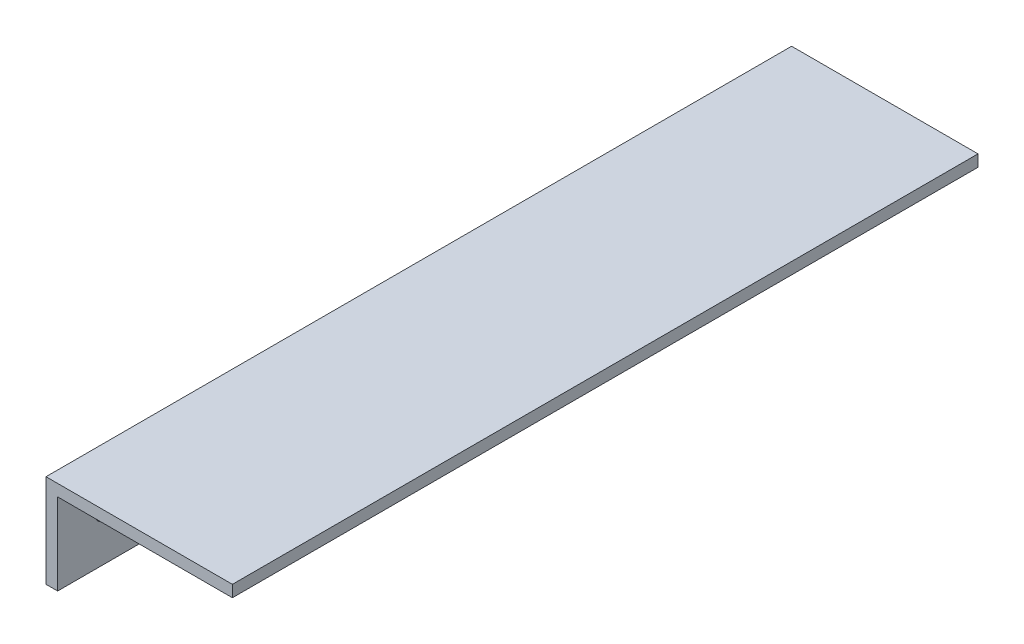
ISO-10303-21;
HEADER;
FILE_DESCRIPTION(('STEP AP214'),'2;1');
FILE_NAME('part.step','',(''),(''),'','','');
FILE_SCHEMA(('AUTOMOTIVE_DESIGN { 1 0 10303 214 1 1 1 1 }'));
ENDSEC;
DATA;
#1=APPLICATION_CONTEXT('core data for automotive mechanical design processes');
#2=APPLICATION_PROTOCOL_DEFINITION('international standard','automotive_design',2000,#1);
#3=PRODUCT_CONTEXT('',#1,'mechanical');
#4=PRODUCT('Part','Part','',(#3));
#5=PRODUCT_RELATED_PRODUCT_CATEGORY('part','',(#4));
#6=PRODUCT_DEFINITION_FORMATION('','',#4);
#7=PRODUCT_DEFINITION_CONTEXT('part definition',#1,'design');
#8=PRODUCT_DEFINITION('design','',#6,#7);
#9=PRODUCT_DEFINITION_SHAPE('','',#8);
#10=(LENGTH_UNIT() NAMED_UNIT(*) SI_UNIT(.MILLI.,.METRE.));
#11=(NAMED_UNIT(*) PLANE_ANGLE_UNIT() SI_UNIT($,.RADIAN.));
#12=(NAMED_UNIT(*) SI_UNIT($,.STERADIAN.) SOLID_ANGLE_UNIT());
#13=UNCERTAINTY_MEASURE_WITH_UNIT(LENGTH_MEASURE(1.E-05),#10,'distance_accuracy_value','');
#14=(GEOMETRIC_REPRESENTATION_CONTEXT(3) GLOBAL_UNCERTAINTY_ASSIGNED_CONTEXT((#13)) GLOBAL_UNIT_ASSIGNED_CONTEXT((#10,
#11,#12)) REPRESENTATION_CONTEXT('',''));
#15=CARTESIAN_POINT('',(0.,0.,0.));
#16=DIRECTION('',(0.,0.,1.));
#17=DIRECTION('',(1.,0.,0.));
#18=AXIS2_PLACEMENT_3D('',#15,#16,#17);
#19=CARTESIAN_POINT('',(3.175,6.34999999999999,203.2));
#20=DIRECTION('',(1.,0.,0.));
#21=DIRECTION('',(0.,-1.,0.));
#22=AXIS2_PLACEMENT_3D('',#19,#20,#21);
#23=PLANE('',#22);
#24=CARTESIAN_POINT('',(3.17500000000001,-6.35000000000001,190.5));
#25=DIRECTION('',(-1.,0.,0.));
#26=DIRECTION('',(0.,-1.,0.));
#27=AXIS2_PLACEMENT_3D('',#24,#25,#26);
#28=CIRCLE('',#27,2.38125000000001);
#29=CARTESIAN_POINT('',(3.17500000000001,-8.73125000000001,190.5));
#30=VERTEX_POINT('',#29);
#31=EDGE_CURVE('E121',#30,#30,#28,.T.);
#32=ORIENTED_EDGE('',*,*,#31,.T.);
#33=EDGE_LOOP('',(#32));
#34=FACE_BOUND('',#33,.T.);
#35=CARTESIAN_POINT('',(3.17500000000001,-6.35000000000001,139.7));
#36=DIRECTION('',(-1.,0.,0.));
#37=DIRECTION('',(0.,-1.,0.));
#38=AXIS2_PLACEMENT_3D('',#35,#36,#37);
#39=CIRCLE('',#38,2.38125000000001);
#40=CARTESIAN_POINT('',(3.17500000000001,-8.73125000000001,139.7));
#41=VERTEX_POINT('',#40);
#42=EDGE_CURVE('E213',#41,#41,#39,.T.);
#43=ORIENTED_EDGE('',*,*,#42,.T.);
#44=EDGE_LOOP('',(#43));
#45=FACE_BOUND('',#44,.T.);
#46=CARTESIAN_POINT('',(3.17500000000001,-6.35000000000001,88.9000000000001));
#47=DIRECTION('',(-1.,0.,0.));
#48=DIRECTION('',(0.,-1.,0.));
#49=AXIS2_PLACEMENT_3D('',#46,#47,#48);
#50=CIRCLE('',#49,2.38125000000001);
#51=CARTESIAN_POINT('',(3.17500000000001,-8.73125000000001,88.9000000000001));
#52=VERTEX_POINT('',#51);
#53=EDGE_CURVE('E211',#52,#52,#50,.T.);
#54=ORIENTED_EDGE('',*,*,#53,.T.);
#55=EDGE_LOOP('',(#54));
#56=FACE_BOUND('',#55,.T.);
#57=CARTESIAN_POINT('',(3.17500000000001,-6.35000000000001,38.1000000000001));
#58=DIRECTION('',(-1.,0.,0.));
#59=DIRECTION('',(0.,-1.,0.));
#60=AXIS2_PLACEMENT_3D('',#57,#58,#59);
#61=CIRCLE('',#60,2.38125000000001);
#62=CARTESIAN_POINT('',(3.17500000000001,-8.73125000000001,38.1000000000001));
#63=VERTEX_POINT('',#62);
#64=EDGE_CURVE('E208',#63,#63,#61,.T.);
#65=ORIENTED_EDGE('',*,*,#64,.T.);
#66=EDGE_LOOP('',(#65));
#67=FACE_BOUND('',#66,.T.);
#68=DIRECTION('',(0.,0.,-1.));
#69=VECTOR('',#68,1.);
#70=CARTESIAN_POINT('',(3.175,3.175,203.2));
#71=LINE('',#70,#69);
#72=CARTESIAN_POINT('',(3.175,3.175,203.2));
#73=VERTEX_POINT('',#72);
#74=CARTESIAN_POINT('',(3.175,3.175,0.));
#75=VERTEX_POINT('',#74);
#76=EDGE_CURVE('E114',#73,#75,#71,.T.);
#77=ORIENTED_EDGE('',*,*,#76,.F.);
#78=DIRECTION('',(0.,1.,0.));
#79=VECTOR('',#78,1.);
#80=CARTESIAN_POINT('',(3.175,6.34999999999999,203.2));
#81=LINE('',#80,#79);
#82=CARTESIAN_POINT('',(3.17500000000001,-19.05,203.2));
#83=VERTEX_POINT('',#82);
#84=EDGE_CURVE('E100',#83,#73,#81,.T.);
#85=ORIENTED_EDGE('',*,*,#84,.F.);
#86=DIRECTION('',(0.,0.,-1.));
#87=VECTOR('',#86,1.);
#88=CARTESIAN_POINT('',(3.17500000000001,-19.05,203.2));
#89=LINE('',#88,#87);
#90=CARTESIAN_POINT('',(3.17500000000001,-19.05,14.9909517868229));
#91=VERTEX_POINT('',#90);
#92=EDGE_CURVE('E106',#83,#91,#89,.T.);
#93=ORIENTED_EDGE('',*,*,#92,.T.);
#94=DIRECTION('',(0.,-0.829037572555043,0.559192903470745));
#95=VECTOR('',#94,1.);
#96=CARTESIAN_POINT('',(3.17500000000002,-88.8446916569376,62.0680657398183));
#97=LINE('',#96,#95);
#98=EDGE_CURVE('E152',#75,#91,#97,.T.);
#99=ORIENTED_EDGE('',*,*,#98,.F.);
#100=EDGE_LOOP('',(#77,#85,#93,#99));
#101=FACE_BOUND('',#100,.T.);
#102=ADVANCED_FACE('F41',(#34,#45,#56,#67,#101),#23,.T.);
#103=CARTESIAN_POINT('',(0.,-19.05,203.2));
#104=DIRECTION('',(0.,-1.,0.));
#105=DIRECTION('',(-1.,0.,0.));
#106=AXIS2_PLACEMENT_3D('',#103,#104,#105);
#107=PLANE('',#106);
#108=ORIENTED_EDGE('',*,*,#92,.F.);
#109=DIRECTION('',(1.,0.,0.));
#110=VECTOR('',#109,1.);
#111=CARTESIAN_POINT('',(0.,-19.05,203.2));
#112=LINE('',#111,#110);
#113=CARTESIAN_POINT('',(0.,-19.05,203.2));
#114=VERTEX_POINT('',#113);
#115=EDGE_CURVE('E97',#114,#83,#112,.T.);
#116=ORIENTED_EDGE('',*,*,#115,.F.);
#117=DIRECTION('',(0.,0.,-1.));
#118=VECTOR('',#117,1.);
#119=CARTESIAN_POINT('',(0.,-19.05,203.2));
#120=LINE('',#119,#118);
#121=CARTESIAN_POINT('',(0.,-19.05,14.9909517868229));
#122=VERTEX_POINT('',#121);
#123=EDGE_CURVE('E111',#114,#122,#120,.T.);
#124=ORIENTED_EDGE('',*,*,#123,.T.);
#125=DIRECTION('',(-1.,0.,0.));
#126=VECTOR('',#125,1.);
#127=CARTESIAN_POINT('',(0.,-19.05,14.9909517868229));
#128=LINE('',#127,#126);
#129=EDGE_CURVE('E49',#91,#122,#128,.T.);
#130=ORIENTED_EDGE('',*,*,#129,.F.);
#131=EDGE_LOOP('',(#108,#116,#124,#130));
#132=FACE_BOUND('',#131,.T.);
#133=ADVANCED_FACE('F107',(#132),#107,.T.);
#134=CARTESIAN_POINT('',(0.,6.34999999999999,203.2));
#135=DIRECTION('',(-1.,0.,0.));
#136=DIRECTION('',(0.,0.,1.));
#137=AXIS2_PLACEMENT_3D('',#134,#135,#136);
#138=PLANE('',#137);
#139=CARTESIAN_POINT('',(0.,-6.35000000000001,190.5));
#140=DIRECTION('',(1.,0.,0.));
#141=DIRECTION('',(0.,0.,1.));
#142=AXIS2_PLACEMENT_3D('',#139,#140,#141);
#143=CIRCLE('',#142,2.38125000000001);
#144=CARTESIAN_POINT('',(0.,-6.35000000000001,192.88125));
#145=VERTEX_POINT('',#144);
#146=EDGE_CURVE('E191',#145,#145,#143,.T.);
#147=ORIENTED_EDGE('',*,*,#146,.T.);
#148=EDGE_LOOP('',(#147));
#149=FACE_BOUND('',#148,.T.);
#150=CARTESIAN_POINT('',(0.,-6.35000000000001,139.7));
#151=DIRECTION('',(1.,0.,0.));
#152=DIRECTION('',(0.,0.,1.));
#153=AXIS2_PLACEMENT_3D('',#150,#151,#152);
#154=CIRCLE('',#153,2.38125000000001);
#155=CARTESIAN_POINT('',(0.,-6.35000000000001,142.08125));
#156=VERTEX_POINT('',#155);
#157=EDGE_CURVE('E195',#156,#156,#154,.T.);
#158=ORIENTED_EDGE('',*,*,#157,.T.);
#159=EDGE_LOOP('',(#158));
#160=FACE_BOUND('',#159,.T.);
#161=CARTESIAN_POINT('',(0.,-6.35000000000001,88.9000000000001));
#162=DIRECTION('',(1.,0.,0.));
#163=DIRECTION('',(0.,0.,1.));
#164=AXIS2_PLACEMENT_3D('',#161,#162,#163);
#165=CIRCLE('',#164,2.38125000000001);
#166=CARTESIAN_POINT('',(0.,-6.35000000000001,91.2812500000001));
#167=VERTEX_POINT('',#166);
#168=EDGE_CURVE('E199',#167,#167,#165,.T.);
#169=ORIENTED_EDGE('',*,*,#168,.T.);
#170=EDGE_LOOP('',(#169));
#171=FACE_BOUND('',#170,.T.);
#172=CARTESIAN_POINT('',(0.,-6.35000000000001,38.1000000000001));
#173=DIRECTION('',(1.,0.,0.));
#174=DIRECTION('',(0.,0.,1.));
#175=AXIS2_PLACEMENT_3D('',#172,#173,#174);
#176=CIRCLE('',#175,2.38125000000001);
#177=CARTESIAN_POINT('',(0.,-6.35000000000001,40.4812500000001));
#178=VERTEX_POINT('',#177);
#179=EDGE_CURVE('E202',#178,#178,#176,.T.);
#180=ORIENTED_EDGE('',*,*,#179,.T.);
#181=EDGE_LOOP('',(#180));
#182=FACE_BOUND('',#181,.T.);
#183=ORIENTED_EDGE('',*,*,#123,.F.);
#184=DIRECTION('',(0.,-1.,0.));
#185=VECTOR('',#184,1.);
#186=CARTESIAN_POINT('',(0.,6.34999999999999,203.2));
#187=LINE('',#186,#185);
#188=CARTESIAN_POINT('',(0.,6.34999999999999,203.2));
#189=VERTEX_POINT('',#188);
#190=EDGE_CURVE('E103',#189,#114,#187,.T.);
#191=ORIENTED_EDGE('',*,*,#190,.F.);
#192=DIRECTION('',(0.,0.,-1.));
#193=VECTOR('',#192,1.);
#194=CARTESIAN_POINT('',(0.,6.34999999999999,203.2));
#195=LINE('',#194,#193);
#196=CARTESIAN_POINT('',(0.,6.34999999999999,0.));
#197=VERTEX_POINT('',#196);
#198=EDGE_CURVE('E147',#189,#197,#195,.T.);
#199=ORIENTED_EDGE('',*,*,#198,.T.);
#200=DIRECTION('',(0.,-1.,0.));
#201=VECTOR('',#200,1.);
#202=CARTESIAN_POINT('',(0.,6.34999999999999,0.));
#203=LINE('',#202,#201);
#204=CARTESIAN_POINT('',(0.,3.1750000000001,0.));
#205=VERTEX_POINT('',#204);
#206=EDGE_CURVE('E133',#197,#205,#203,.T.);
#207=ORIENTED_EDGE('',*,*,#206,.T.);
#208=DIRECTION('',(0.,0.829037572555043,-0.559192903470745));
#209=VECTOR('',#208,1.);
#210=CARTESIAN_POINT('',(0.,-88.8446916569376,62.0680657398183));
#211=LINE('',#210,#209);
#212=EDGE_CURVE('E11',#122,#205,#211,.T.);
#213=ORIENTED_EDGE('',*,*,#212,.F.);
#214=EDGE_LOOP('',(#183,#191,#199,#207,#213));
#215=FACE_BOUND('',#214,.T.);
#216=ADVANCED_FACE('F154',(#149,#160,#171,#182,#215),#138,.T.);
#217=CARTESIAN_POINT('',(0.,6.34999999999999,203.2));
#218=DIRECTION('',(0.,-1.,0.));
#219=DIRECTION('',(0.,0.,1.));
#220=AXIS2_PLACEMENT_3D('',#217,#218,#219);
#221=PLANE('',#220);
#222=DIRECTION('',(1.,0.,0.));
#223=VECTOR('',#222,1.);
#224=CARTESIAN_POINT('',(0.,6.34999999999999,0.));
#225=LINE('',#224,#223);
#226=CARTESIAN_POINT('',(50.8,6.35000000000001,0.));
#227=VERTEX_POINT('',#226);
#228=EDGE_CURVE('E135',#197,#227,#225,.T.);
#229=ORIENTED_EDGE('',*,*,#228,.F.);
#230=ORIENTED_EDGE('',*,*,#198,.F.);
#231=DIRECTION('',(1.,0.,0.));
#232=VECTOR('',#231,1.);
#233=CARTESIAN_POINT('',(0.,6.34999999999999,203.2));
#234=LINE('',#233,#232);
#235=CARTESIAN_POINT('',(50.8,6.35000000000001,203.2));
#236=VERTEX_POINT('',#235);
#237=EDGE_CURVE('E125',#189,#236,#234,.T.);
#238=ORIENTED_EDGE('',*,*,#237,.T.);
#239=DIRECTION('',(0.,0.,-1.));
#240=VECTOR('',#239,1.);
#241=CARTESIAN_POINT('',(50.8,6.35000000000001,203.2));
#242=LINE('',#241,#240);
#243=EDGE_CURVE('E144',#236,#227,#242,.T.);
#244=ORIENTED_EDGE('',*,*,#243,.T.);
#245=EDGE_LOOP('',(#229,#230,#238,#244));
#246=FACE_BOUND('',#245,.T.);
#247=ADVANCED_FACE('F158',(#246),#221,.F.);
#248=CARTESIAN_POINT('',(50.8,6.35000000000001,203.2));
#249=DIRECTION('',(-1.,0.,0.));
#250=DIRECTION('',(0.,0.,1.));
#251=AXIS2_PLACEMENT_3D('',#248,#249,#250);
#252=PLANE('',#251);
#253=DIRECTION('',(0.,-1.,0.));
#254=VECTOR('',#253,1.);
#255=CARTESIAN_POINT('',(50.8,6.35000000000001,0.));
#256=LINE('',#255,#254);
#257=CARTESIAN_POINT('',(50.8,3.175,0.));
#258=VERTEX_POINT('',#257);
#259=EDGE_CURVE('E118',#227,#258,#256,.T.);
#260=ORIENTED_EDGE('',*,*,#259,.F.);
#261=ORIENTED_EDGE('',*,*,#243,.F.);
#262=DIRECTION('',(0.,-1.,0.));
#263=VECTOR('',#262,1.);
#264=CARTESIAN_POINT('',(50.8,6.35000000000001,203.2));
#265=LINE('',#264,#263);
#266=CARTESIAN_POINT('',(50.8,3.175,203.2));
#267=VERTEX_POINT('',#266);
#268=EDGE_CURVE('E128',#236,#267,#265,.T.);
#269=ORIENTED_EDGE('',*,*,#268,.T.);
#270=DIRECTION('',(0.,0.,-1.));
#271=VECTOR('',#270,1.);
#272=CARTESIAN_POINT('',(50.8,3.175,203.2));
#273=LINE('',#272,#271);
#274=EDGE_CURVE('E141',#267,#258,#273,.T.);
#275=ORIENTED_EDGE('',*,*,#274,.T.);
#276=EDGE_LOOP('',(#260,#261,#269,#275));
#277=FACE_BOUND('',#276,.T.);
#278=ADVANCED_FACE('F166',(#277),#252,.F.);
#279=CARTESIAN_POINT('',(0.,3.175,203.2));
#280=DIRECTION('',(0.,1.,0.));
#281=DIRECTION('',(1.,0.,0.));
#282=AXIS2_PLACEMENT_3D('',#279,#280,#281);
#283=PLANE('',#282);
#284=DIRECTION('',(-1.,0.,0.));
#285=VECTOR('',#284,1.);
#286=CARTESIAN_POINT('',(0.,3.175,0.));
#287=LINE('',#286,#285);
#288=EDGE_CURVE('E115',#258,#75,#287,.T.);
#289=ORIENTED_EDGE('',*,*,#288,.F.);
#290=ORIENTED_EDGE('',*,*,#274,.F.);
#291=DIRECTION('',(-1.,0.,0.));
#292=VECTOR('',#291,1.);
#293=CARTESIAN_POINT('',(0.,3.175,203.2));
#294=LINE('',#293,#292);
#295=EDGE_CURVE('E131',#267,#73,#294,.T.);
#296=ORIENTED_EDGE('',*,*,#295,.T.);
#297=ORIENTED_EDGE('',*,*,#76,.T.);
#298=EDGE_LOOP('',(#289,#290,#296,#297));
#299=FACE_BOUND('',#298,.T.);
#300=ADVANCED_FACE('F164',(#299),#283,.F.);
#301=CARTESIAN_POINT('',(0.,6.34999999999999,203.2));
#302=DIRECTION('',(0.,0.,1.));
#303=DIRECTION('',(1.,0.,0.));
#304=AXIS2_PLACEMENT_3D('',#301,#302,#303);
#305=PLANE('',#304);
#306=ORIENTED_EDGE('',*,*,#84,.T.);
#307=ORIENTED_EDGE('',*,*,#295,.F.);
#308=ORIENTED_EDGE('',*,*,#268,.F.);
#309=ORIENTED_EDGE('',*,*,#237,.F.);
#310=ORIENTED_EDGE('',*,*,#190,.T.);
#311=ORIENTED_EDGE('',*,*,#115,.T.);
#312=EDGE_LOOP('',(#306,#307,#308,#309,#310,#311));
#313=FACE_BOUND('',#312,.T.);
#314=ADVANCED_FACE('F98',(#313),#305,.T.);
#315=CARTESIAN_POINT('',(0.,6.34999999999999,0.));
#316=DIRECTION('',(0.,0.,1.));
#317=DIRECTION('',(1.,0.,0.));
#318=AXIS2_PLACEMENT_3D('',#315,#316,#317);
#319=PLANE('',#318);
#320=ORIENTED_EDGE('',*,*,#206,.F.);
#321=ORIENTED_EDGE('',*,*,#228,.T.);
#322=ORIENTED_EDGE('',*,*,#259,.T.);
#323=ORIENTED_EDGE('',*,*,#288,.T.);
#324=DIRECTION('',(1.,0.,0.));
#325=VECTOR('',#324,1.);
#326=CARTESIAN_POINT('',(3.175,3.1750000000001,0.));
#327=LINE('',#326,#325);
#328=EDGE_CURVE('E110',#205,#75,#327,.T.);
#329=ORIENTED_EDGE('',*,*,#328,.F.);
#330=EDGE_LOOP('',(#320,#321,#322,#323,#329));
#331=FACE_BOUND('',#330,.T.);
#332=ADVANCED_FACE('F161',(#331),#319,.F.);
#333=CARTESIAN_POINT('',(50.8,-6.34999999999999,38.1000000000001));
#334=DIRECTION('',(-1.,0.,0.));
#335=DIRECTION('',(0.,0.,1.));
#336=AXIS2_PLACEMENT_3D('',#333,#334,#335);
#337=CYLINDRICAL_SURFACE('',#336,2.38125000000001);
#338=ORIENTED_EDGE('',*,*,#64,.F.);
#339=EDGE_LOOP('',(#338));
#340=FACE_BOUND('',#339,.T.);
#341=ORIENTED_EDGE('',*,*,#179,.F.);
#342=EDGE_LOOP('',(#341));
#343=FACE_BOUND('',#342,.T.);
#344=ADVANCED_FACE('F234',(#340,#343),#337,.F.);
#345=CARTESIAN_POINT('',(50.8,-6.34999999999999,88.9000000000001));
#346=DIRECTION('',(-1.,0.,0.));
#347=DIRECTION('',(0.,0.,1.));
#348=AXIS2_PLACEMENT_3D('',#345,#346,#347);
#349=CYLINDRICAL_SURFACE('',#348,2.38125000000001);
#350=ORIENTED_EDGE('',*,*,#53,.F.);
#351=EDGE_LOOP('',(#350));
#352=FACE_BOUND('',#351,.T.);
#353=ORIENTED_EDGE('',*,*,#168,.F.);
#354=EDGE_LOOP('',(#353));
#355=FACE_BOUND('',#354,.T.);
#356=ADVANCED_FACE('F228',(#352,#355),#349,.F.);
#357=CARTESIAN_POINT('',(50.8,-6.34999999999999,139.7));
#358=DIRECTION('',(-1.,0.,0.));
#359=DIRECTION('',(0.,0.,1.));
#360=AXIS2_PLACEMENT_3D('',#357,#358,#359);
#361=CYLINDRICAL_SURFACE('',#360,2.38125000000001);
#362=ORIENTED_EDGE('',*,*,#42,.F.);
#363=EDGE_LOOP('',(#362));
#364=FACE_BOUND('',#363,.T.);
#365=ORIENTED_EDGE('',*,*,#157,.F.);
#366=EDGE_LOOP('',(#365));
#367=FACE_BOUND('',#366,.T.);
#368=ADVANCED_FACE('F221',(#364,#367),#361,.F.);
#369=CARTESIAN_POINT('',(50.8,-6.34999999999999,190.5));
#370=DIRECTION('',(-1.,0.,0.));
#371=DIRECTION('',(0.,0.,1.));
#372=AXIS2_PLACEMENT_3D('',#369,#370,#371);
#373=CYLINDRICAL_SURFACE('',#372,2.38125000000001);
#374=ORIENTED_EDGE('',*,*,#31,.F.);
#375=EDGE_LOOP('',(#374));
#376=FACE_BOUND('',#375,.T.);
#377=ORIENTED_EDGE('',*,*,#146,.F.);
#378=EDGE_LOOP('',(#377));
#379=FACE_BOUND('',#378,.T.);
#380=ADVANCED_FACE('F218',(#376,#379),#373,.F.);
#381=CARTESIAN_POINT('',(0.,3.1750000000001,0.));
#382=DIRECTION('',(0.,-0.559192903470745,-0.829037572555043));
#383=DIRECTION('',(-1.,0.,0.));
#384=AXIS2_PLACEMENT_3D('',#381,#382,#383);
#385=PLANE('',#384);
#386=ORIENTED_EDGE('',*,*,#212,.T.);
#387=ORIENTED_EDGE('',*,*,#328,.T.);
#388=ORIENTED_EDGE('',*,*,#98,.T.);
#389=ORIENTED_EDGE('',*,*,#129,.T.);
#390=EDGE_LOOP('',(#386,#387,#388,#389));
#391=FACE_BOUND('',#390,.T.);
#392=ADVANCED_FACE('F43',(#391),#385,.T.);
#393=CLOSED_SHELL('',(#102,#133,#216,#247,#278,#300,#314,#332,#344,#356,#368,#380,#392));
#394=MANIFOLD_SOLID_BREP('B2',#393);
#395=ADVANCED_BREP_SHAPE_REPRESENTATION('',(#18,#394),#14);
#396=SHAPE_DEFINITION_REPRESENTATION(#9,#395);
ENDSEC;
END-ISO-10303-21;
